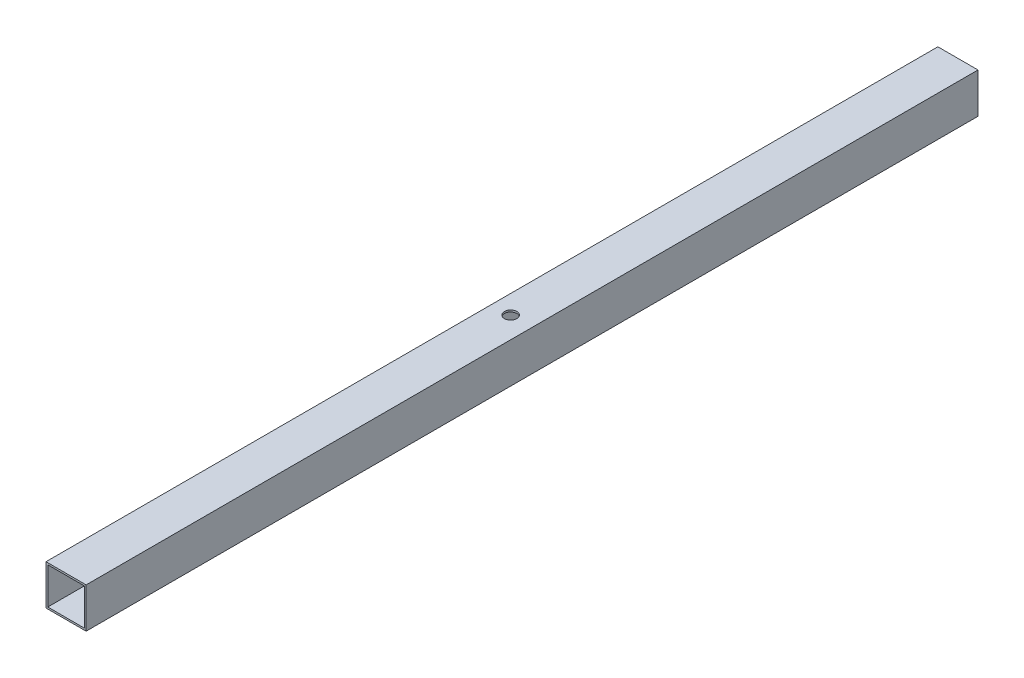
ISO-10303-21;
HEADER;
FILE_DESCRIPTION(('STEP AP214'),'2;1');
FILE_NAME('part.step','',(''),(''),'','','');
FILE_SCHEMA(('AUTOMOTIVE_DESIGN { 1 0 10303 214 1 1 1 1 }'));
ENDSEC;
DATA;
#1=APPLICATION_CONTEXT('core data for automotive mechanical design processes');
#2=APPLICATION_PROTOCOL_DEFINITION('international standard','automotive_design',2000,#1);
#3=PRODUCT_CONTEXT('',#1,'mechanical');
#4=PRODUCT('Part','Part','',(#3));
#5=PRODUCT_RELATED_PRODUCT_CATEGORY('part','',(#4));
#6=PRODUCT_DEFINITION_FORMATION('','',#4);
#7=PRODUCT_DEFINITION_CONTEXT('part definition',#1,'design');
#8=PRODUCT_DEFINITION('design','',#6,#7);
#9=PRODUCT_DEFINITION_SHAPE('','',#8);
#10=(LENGTH_UNIT() NAMED_UNIT(*) SI_UNIT(.MILLI.,.METRE.));
#11=(NAMED_UNIT(*) PLANE_ANGLE_UNIT() SI_UNIT($,.RADIAN.));
#12=(NAMED_UNIT(*) SI_UNIT($,.STERADIAN.) SOLID_ANGLE_UNIT());
#13=UNCERTAINTY_MEASURE_WITH_UNIT(LENGTH_MEASURE(1.E-05),#10,'distance_accuracy_value','');
#14=(GEOMETRIC_REPRESENTATION_CONTEXT(3) GLOBAL_UNCERTAINTY_ASSIGNED_CONTEXT((#13)) GLOBAL_UNIT_ASSIGNED_CONTEXT((#10,
#11,#12)) REPRESENTATION_CONTEXT('',''));
#15=CARTESIAN_POINT('',(0.,0.,0.));
#16=DIRECTION('',(0.,0.,1.));
#17=DIRECTION('',(1.,0.,0.));
#18=AXIS2_PLACEMENT_3D('',#15,#16,#17);
#19=CARTESIAN_POINT('',(45.,0.,1000.));
#20=DIRECTION('',(0.,1.,0.));
#21=DIRECTION('',(-1.,0.,0.));
#22=AXIS2_PLACEMENT_3D('',#19,#20,#21);
#23=PLANE('',#22);
#24=CARTESIAN_POINT('',(21.,0.,500.));
#25=DIRECTION('',(0.,-1.,0.));
#26=DIRECTION('',(1.,0.,0.));
#27=AXIS2_PLACEMENT_3D('',#24,#25,#26);
#28=CIRCLE('',#27,7.);
#29=CARTESIAN_POINT('',(28.,0.,500.));
#30=VERTEX_POINT('',#29);
#31=EDGE_CURVE('E304',#30,#30,#28,.T.);
#32=ORIENTED_EDGE('',*,*,#31,.F.);
#33=EDGE_LOOP('',(#32));
#34=FACE_BOUND('',#33,.T.);
#35=CARTESIAN_POINT('',(22.5,0.,980.));
#36=DIRECTION('',(0.,-1.,0.));
#37=DIRECTION('',(1.,0.,0.));
#38=AXIS2_PLACEMENT_3D('',#35,#36,#37);
#39=CIRCLE('',#38,7.);
#40=CARTESIAN_POINT('',(29.5,0.,980.));
#41=VERTEX_POINT('',#40);
#42=EDGE_CURVE('E309',#41,#41,#39,.T.);
#43=ORIENTED_EDGE('',*,*,#42,.F.);
#44=EDGE_LOOP('',(#43));
#45=FACE_BOUND('',#44,.T.);
#46=CARTESIAN_POINT('',(22.5,0.,60.));
#47=DIRECTION('',(0.,-1.,0.));
#48=DIRECTION('',(1.,0.,0.));
#49=AXIS2_PLACEMENT_3D('',#46,#47,#48);
#50=CIRCLE('',#49,7.);
#51=CARTESIAN_POINT('',(29.5,0.,60.));
#52=VERTEX_POINT('',#51);
#53=EDGE_CURVE('E299',#52,#52,#50,.T.);
#54=ORIENTED_EDGE('',*,*,#53,.F.);
#55=EDGE_LOOP('',(#54));
#56=FACE_BOUND('',#55,.T.);
#57=CARTESIAN_POINT('',(22.5,0.,20.));
#58=DIRECTION('',(0.,-1.,0.));
#59=DIRECTION('',(1.,0.,0.));
#60=AXIS2_PLACEMENT_3D('',#57,#58,#59);
#61=CIRCLE('',#60,7.);
#62=CARTESIAN_POINT('',(29.5,0.,20.));
#63=VERTEX_POINT('',#62);
#64=EDGE_CURVE('E323',#63,#63,#61,.T.);
#65=ORIENTED_EDGE('',*,*,#64,.F.);
#66=EDGE_LOOP('',(#65));
#67=FACE_BOUND('',#66,.T.);
#68=CARTESIAN_POINT('',(22.5,0.,940.));
#69=DIRECTION('',(0.,-1.,0.));
#70=DIRECTION('',(1.,0.,0.));
#71=AXIS2_PLACEMENT_3D('',#68,#69,#70);
#72=CIRCLE('',#71,7.00000000000001);
#73=CARTESIAN_POINT('',(29.5,0.,940.));
#74=VERTEX_POINT('',#73);
#75=EDGE_CURVE('E313',#74,#74,#72,.T.);
#76=ORIENTED_EDGE('',*,*,#75,.F.);
#77=EDGE_LOOP('',(#76));
#78=FACE_BOUND('',#77,.T.);
#79=DIRECTION('',(1.,0.,0.));
#80=VECTOR('',#79,1.);
#81=CARTESIAN_POINT('',(45.,0.,0.));
#82=LINE('',#81,#80);
#83=CARTESIAN_POINT('',(0.,0.,0.));
#84=VERTEX_POINT('',#83);
#85=CARTESIAN_POINT('',(45.,0.,0.));
#86=VERTEX_POINT('',#85);
#87=EDGE_CURVE('E158',#84,#86,#82,.T.);
#88=ORIENTED_EDGE('',*,*,#87,.T.);
#89=DIRECTION('',(0.,0.,-1.));
#90=VECTOR('',#89,1.);
#91=CARTESIAN_POINT('',(45.,0.,1000.));
#92=LINE('',#91,#90);
#93=CARTESIAN_POINT('',(45.,0.,1000.));
#94=VERTEX_POINT('',#93);
#95=EDGE_CURVE('E11',#94,#86,#92,.T.);
#96=ORIENTED_EDGE('',*,*,#95,.F.);
#97=DIRECTION('',(1.,0.,0.));
#98=VECTOR('',#97,1.);
#99=CARTESIAN_POINT('',(45.,0.,1000.));
#100=LINE('',#99,#98);
#101=CARTESIAN_POINT('',(0.,0.,1000.));
#102=VERTEX_POINT('',#101);
#103=EDGE_CURVE('E164',#102,#94,#100,.T.);
#104=ORIENTED_EDGE('',*,*,#103,.F.);
#105=DIRECTION('',(0.,0.,-1.));
#106=VECTOR('',#105,1.);
#107=CARTESIAN_POINT('',(0.,0.,1000.));
#108=LINE('',#107,#106);
#109=EDGE_CURVE('E178',#102,#84,#108,.T.);
#110=ORIENTED_EDGE('',*,*,#109,.T.);
#111=EDGE_LOOP('',(#88,#96,#104,#110));
#112=FACE_BOUND('',#111,.T.);
#113=ADVANCED_FACE('F45',(#34,#45,#56,#67,#78,#112),#23,.F.);
#114=CARTESIAN_POINT('',(45.,45.,1000.));
#115=DIRECTION('',(-1.,0.,0.));
#116=DIRECTION('',(0.,0.,1.));
#117=AXIS2_PLACEMENT_3D('',#114,#115,#116);
#118=PLANE('',#117);
#119=DIRECTION('',(0.,1.,0.));
#120=VECTOR('',#119,1.);
#121=CARTESIAN_POINT('',(45.,45.,0.));
#122=LINE('',#121,#120);
#123=CARTESIAN_POINT('',(45.,45.,0.));
#124=VERTEX_POINT('',#123);
#125=EDGE_CURVE('E182',#86,#124,#122,.T.);
#126=ORIENTED_EDGE('',*,*,#125,.T.);
#127=DIRECTION('',(0.,0.,-1.));
#128=VECTOR('',#127,1.);
#129=CARTESIAN_POINT('',(45.,45.,1000.));
#130=LINE('',#129,#128);
#131=CARTESIAN_POINT('',(45.,45.,1000.));
#132=VERTEX_POINT('',#131);
#133=EDGE_CURVE('E54',#132,#124,#130,.T.);
#134=ORIENTED_EDGE('',*,*,#133,.F.);
#135=DIRECTION('',(0.,1.,0.));
#136=VECTOR('',#135,1.);
#137=CARTESIAN_POINT('',(45.,45.,1000.));
#138=LINE('',#137,#136);
#139=EDGE_CURVE('E168',#94,#132,#138,.T.);
#140=ORIENTED_EDGE('',*,*,#139,.F.);
#141=ORIENTED_EDGE('',*,*,#95,.T.);
#142=EDGE_LOOP('',(#126,#134,#140,#141));
#143=FACE_BOUND('',#142,.T.);
#144=ADVANCED_FACE('F217',(#143),#118,.F.);
#145=CARTESIAN_POINT('',(0.,45.,1000.));
#146=DIRECTION('',(0.,-1.,0.));
#147=DIRECTION('',(0.,0.,-1.));
#148=AXIS2_PLACEMENT_3D('',#145,#146,#147);
#149=PLANE('',#148);
#150=CARTESIAN_POINT('',(21.,45.,500.));
#151=DIRECTION('',(0.,-1.,0.));
#152=DIRECTION('',(1.,0.,0.));
#153=AXIS2_PLACEMENT_3D('',#150,#151,#152);
#154=CIRCLE('',#153,7.);
#155=CARTESIAN_POINT('',(28.,45.,500.));
#156=VERTEX_POINT('',#155);
#157=EDGE_CURVE('E289',#156,#156,#154,.T.);
#158=ORIENTED_EDGE('',*,*,#157,.T.);
#159=EDGE_LOOP('',(#158));
#160=FACE_BOUND('',#159,.T.);
#161=DIRECTION('',(-1.,0.,0.));
#162=VECTOR('',#161,1.);
#163=CARTESIAN_POINT('',(0.,45.,0.));
#164=LINE('',#163,#162);
#165=CARTESIAN_POINT('',(0.,45.,0.));
#166=VERTEX_POINT('',#165);
#167=EDGE_CURVE('E185',#124,#166,#164,.T.);
#168=ORIENTED_EDGE('',*,*,#167,.T.);
#169=DIRECTION('',(0.,0.,-1.));
#170=VECTOR('',#169,1.);
#171=CARTESIAN_POINT('',(0.,45.,1000.));
#172=LINE('',#171,#170);
#173=CARTESIAN_POINT('',(0.,45.,1000.));
#174=VERTEX_POINT('',#173);
#175=EDGE_CURVE('E193',#174,#166,#172,.T.);
#176=ORIENTED_EDGE('',*,*,#175,.F.);
#177=DIRECTION('',(-1.,0.,0.));
#178=VECTOR('',#177,1.);
#179=CARTESIAN_POINT('',(0.,45.,1000.));
#180=LINE('',#179,#178);
#181=EDGE_CURVE('E172',#132,#174,#180,.T.);
#182=ORIENTED_EDGE('',*,*,#181,.F.);
#183=ORIENTED_EDGE('',*,*,#133,.T.);
#184=EDGE_LOOP('',(#168,#176,#182,#183));
#185=FACE_BOUND('',#184,.T.);
#186=ADVANCED_FACE('F203',(#160,#185),#149,.F.);
#187=CARTESIAN_POINT('',(0.,0.,1000.));
#188=DIRECTION('',(1.,0.,0.));
#189=DIRECTION('',(0.,0.,-1.));
#190=AXIS2_PLACEMENT_3D('',#187,#188,#189);
#191=PLANE('',#190);
#192=DIRECTION('',(0.,-1.,0.));
#193=VECTOR('',#192,1.);
#194=CARTESIAN_POINT('',(0.,0.,0.));
#195=LINE('',#194,#193);
#196=EDGE_CURVE('E169',#166,#84,#195,.T.);
#197=ORIENTED_EDGE('',*,*,#196,.T.);
#198=ORIENTED_EDGE('',*,*,#109,.F.);
#199=DIRECTION('',(0.,-1.,0.));
#200=VECTOR('',#199,1.);
#201=CARTESIAN_POINT('',(0.,0.,1000.));
#202=LINE('',#201,#200);
#203=EDGE_CURVE('E175',#174,#102,#202,.T.);
#204=ORIENTED_EDGE('',*,*,#203,.F.);
#205=ORIENTED_EDGE('',*,*,#175,.T.);
#206=EDGE_LOOP('',(#197,#198,#204,#205));
#207=FACE_BOUND('',#206,.T.);
#208=ADVANCED_FACE('F212',(#207),#191,.F.);
#209=CARTESIAN_POINT('',(0.,0.,1000.));
#210=DIRECTION('',(0.,0.,-1.));
#211=DIRECTION('',(-1.,0.,0.));
#212=AXIS2_PLACEMENT_3D('',#209,#210,#211);
#213=PLANE('',#212);
#214=DIRECTION('',(1.,0.,0.));
#215=VECTOR('',#214,1.);
#216=CARTESIAN_POINT('',(43.,43.,1000.));
#217=LINE('',#216,#215);
#218=CARTESIAN_POINT('',(2.,43.,1000.));
#219=VERTEX_POINT('',#218);
#220=CARTESIAN_POINT('',(43.,43.,1000.));
#221=VERTEX_POINT('',#220);
#222=EDGE_CURVE('E120',#219,#221,#217,.T.);
#223=ORIENTED_EDGE('',*,*,#222,.T.);
#224=DIRECTION('',(0.,-1.,0.));
#225=VECTOR('',#224,1.);
#226=CARTESIAN_POINT('',(43.,43.,1000.));
#227=LINE('',#226,#225);
#228=CARTESIAN_POINT('',(43.,2.,1000.));
#229=VERTEX_POINT('',#228);
#230=EDGE_CURVE('E113',#221,#229,#227,.T.);
#231=ORIENTED_EDGE('',*,*,#230,.T.);
#232=DIRECTION('',(-1.,0.,0.));
#233=VECTOR('',#232,1.);
#234=CARTESIAN_POINT('',(43.,2.,1000.));
#235=LINE('',#234,#233);
#236=CARTESIAN_POINT('',(1.99999999999999,2.,1000.));
#237=VERTEX_POINT('',#236);
#238=EDGE_CURVE('E123',#229,#237,#235,.T.);
#239=ORIENTED_EDGE('',*,*,#238,.T.);
#240=DIRECTION('',(0.,1.,0.));
#241=VECTOR('',#240,1.);
#242=CARTESIAN_POINT('',(2.,43.,1000.));
#243=LINE('',#242,#241);
#244=EDGE_CURVE('E61',#237,#219,#243,.T.);
#245=ORIENTED_EDGE('',*,*,#244,.T.);
#246=EDGE_LOOP('',(#223,#231,#239,#245));
#247=FACE_BOUND('',#246,.T.);
#248=ORIENTED_EDGE('',*,*,#103,.T.);
#249=ORIENTED_EDGE('',*,*,#139,.T.);
#250=ORIENTED_EDGE('',*,*,#181,.T.);
#251=ORIENTED_EDGE('',*,*,#203,.T.);
#252=EDGE_LOOP('',(#248,#249,#250,#251));
#253=FACE_BOUND('',#252,.T.);
#254=ADVANCED_FACE('F128',(#247,#253),#213,.F.);
#255=CARTESIAN_POINT('',(0.,0.,0.));
#256=DIRECTION('',(0.,0.,-1.));
#257=DIRECTION('',(-1.,0.,0.));
#258=AXIS2_PLACEMENT_3D('',#255,#256,#257);
#259=PLANE('',#258);
#260=DIRECTION('',(0.,-1.,0.));
#261=VECTOR('',#260,1.);
#262=CARTESIAN_POINT('',(43.,43.,0.));
#263=LINE('',#262,#261);
#264=CARTESIAN_POINT('',(43.,43.,0.));
#265=VERTEX_POINT('',#264);
#266=CARTESIAN_POINT('',(43.,2.,0.));
#267=VERTEX_POINT('',#266);
#268=EDGE_CURVE('E69',#265,#267,#263,.T.);
#269=ORIENTED_EDGE('',*,*,#268,.F.);
#270=DIRECTION('',(1.,0.,0.));
#271=VECTOR('',#270,1.);
#272=CARTESIAN_POINT('',(43.,43.,0.));
#273=LINE('',#272,#271);
#274=CARTESIAN_POINT('',(2.,43.,0.));
#275=VERTEX_POINT('',#274);
#276=EDGE_CURVE('E132',#275,#265,#273,.T.);
#277=ORIENTED_EDGE('',*,*,#276,.F.);
#278=DIRECTION('',(0.,1.,0.));
#279=VECTOR('',#278,1.);
#280=CARTESIAN_POINT('',(2.,43.,0.));
#281=LINE('',#280,#279);
#282=CARTESIAN_POINT('',(1.99999999999999,2.,0.));
#283=VERTEX_POINT('',#282);
#284=EDGE_CURVE('E136',#283,#275,#281,.T.);
#285=ORIENTED_EDGE('',*,*,#284,.F.);
#286=DIRECTION('',(-1.,0.,0.));
#287=VECTOR('',#286,1.);
#288=CARTESIAN_POINT('',(43.,2.,0.));
#289=LINE('',#288,#287);
#290=EDGE_CURVE('E148',#267,#283,#289,.T.);
#291=ORIENTED_EDGE('',*,*,#290,.F.);
#292=EDGE_LOOP('',(#269,#277,#285,#291));
#293=FACE_BOUND('',#292,.T.);
#294=ORIENTED_EDGE('',*,*,#87,.F.);
#295=ORIENTED_EDGE('',*,*,#196,.F.);
#296=ORIENTED_EDGE('',*,*,#167,.F.);
#297=ORIENTED_EDGE('',*,*,#125,.F.);
#298=EDGE_LOOP('',(#294,#295,#296,#297));
#299=FACE_BOUND('',#298,.T.);
#300=ADVANCED_FACE('F209',(#293,#299),#259,.T.);
#301=CARTESIAN_POINT('',(43.,43.,1000.));
#302=DIRECTION('',(1.,0.,0.));
#303=DIRECTION('',(0.,1.,0.));
#304=AXIS2_PLACEMENT_3D('',#301,#302,#303);
#305=PLANE('',#304);
#306=ORIENTED_EDGE('',*,*,#268,.T.);
#307=DIRECTION('',(0.,0.,-1.));
#308=VECTOR('',#307,1.);
#309=CARTESIAN_POINT('',(43.,2.,1000.));
#310=LINE('',#309,#308);
#311=EDGE_CURVE('E109',#229,#267,#310,.T.);
#312=ORIENTED_EDGE('',*,*,#311,.F.);
#313=ORIENTED_EDGE('',*,*,#230,.F.);
#314=DIRECTION('',(0.,0.,-1.));
#315=VECTOR('',#314,1.);
#316=CARTESIAN_POINT('',(43.,43.,1000.));
#317=LINE('',#316,#315);
#318=EDGE_CURVE('E155',#221,#265,#317,.T.);
#319=ORIENTED_EDGE('',*,*,#318,.T.);
#320=EDGE_LOOP('',(#306,#312,#313,#319));
#321=FACE_BOUND('',#320,.T.);
#322=ADVANCED_FACE('F111',(#321),#305,.F.);
#323=CARTESIAN_POINT('',(43.,43.,1000.));
#324=DIRECTION('',(0.,1.,0.));
#325=DIRECTION('',(0.,0.,1.));
#326=AXIS2_PLACEMENT_3D('',#323,#324,#325);
#327=PLANE('',#326);
#328=CARTESIAN_POINT('',(21.,43.,500.));
#329=DIRECTION('',(0.,1.,0.));
#330=DIRECTION('',(0.,0.,1.));
#331=AXIS2_PLACEMENT_3D('',#328,#329,#330);
#332=CIRCLE('',#331,7.);
#333=CARTESIAN_POINT('',(28.,43.,500.));
#334=VERTEX_POINT('',#333);
#335=EDGE_CURVE('E292',#334,#334,#332,.T.);
#336=ORIENTED_EDGE('',*,*,#335,.T.);
#337=EDGE_LOOP('',(#336));
#338=FACE_BOUND('',#337,.T.);
#339=ORIENTED_EDGE('',*,*,#276,.T.);
#340=ORIENTED_EDGE('',*,*,#318,.F.);
#341=ORIENTED_EDGE('',*,*,#222,.F.);
#342=DIRECTION('',(0.,0.,-1.));
#343=VECTOR('',#342,1.);
#344=CARTESIAN_POINT('',(2.,43.,1000.));
#345=LINE('',#344,#343);
#346=EDGE_CURVE('E159',#219,#275,#345,.T.);
#347=ORIENTED_EDGE('',*,*,#346,.T.);
#348=EDGE_LOOP('',(#339,#340,#341,#347));
#349=FACE_BOUND('',#348,.T.);
#350=ADVANCED_FACE('F236',(#338,#349),#327,.F.);
#351=CARTESIAN_POINT('',(2.,43.,1000.));
#352=DIRECTION('',(-1.,0.,0.));
#353=DIRECTION('',(0.,-1.,0.));
#354=AXIS2_PLACEMENT_3D('',#351,#352,#353);
#355=PLANE('',#354);
#356=ORIENTED_EDGE('',*,*,#284,.T.);
#357=ORIENTED_EDGE('',*,*,#346,.F.);
#358=ORIENTED_EDGE('',*,*,#244,.F.);
#359=DIRECTION('',(0.,0.,-1.));
#360=VECTOR('',#359,1.);
#361=CARTESIAN_POINT('',(1.99999999999999,2.,1000.));
#362=LINE('',#361,#360);
#363=EDGE_CURVE('E119',#237,#283,#362,.T.);
#364=ORIENTED_EDGE('',*,*,#363,.T.);
#365=EDGE_LOOP('',(#356,#357,#358,#364));
#366=FACE_BOUND('',#365,.T.);
#367=ADVANCED_FACE('F240',(#366),#355,.F.);
#368=CARTESIAN_POINT('',(43.,2.,1000.));
#369=DIRECTION('',(0.,-1.,0.));
#370=DIRECTION('',(0.,0.,-1.));
#371=AXIS2_PLACEMENT_3D('',#368,#369,#370);
#372=PLANE('',#371);
#373=CARTESIAN_POINT('',(21.,2.,500.));
#374=DIRECTION('',(0.,-1.,0.));
#375=DIRECTION('',(0.,0.,-1.));
#376=AXIS2_PLACEMENT_3D('',#373,#374,#375);
#377=CIRCLE('',#376,7.);
#378=CARTESIAN_POINT('',(28.,2.00000000000001,500.));
#379=VERTEX_POINT('',#378);
#380=EDGE_CURVE('E48',#379,#379,#377,.T.);
#381=ORIENTED_EDGE('',*,*,#380,.T.);
#382=EDGE_LOOP('',(#381));
#383=FACE_BOUND('',#382,.T.);
#384=ORIENTED_EDGE('',*,*,#290,.T.);
#385=ORIENTED_EDGE('',*,*,#363,.F.);
#386=ORIENTED_EDGE('',*,*,#238,.F.);
#387=ORIENTED_EDGE('',*,*,#311,.T.);
#388=EDGE_LOOP('',(#384,#385,#386,#387));
#389=FACE_BOUND('',#388,.T.);
#390=ADVANCED_FACE('F124',(#383,#389),#372,.F.);
#391=CARTESIAN_POINT('',(22.5,1.6,940.));
#392=DIRECTION('',(0.,-1.,0.));
#393=DIRECTION('',(1.,0.,0.));
#394=AXIS2_PLACEMENT_3D('',#391,#392,#393);
#395=CYLINDRICAL_SURFACE('',#394,7.00000000000001);
#396=CARTESIAN_POINT('',(22.5,1.6,940.));
#397=DIRECTION('',(0.,-1.,0.));
#398=DIRECTION('',(1.,0.,0.));
#399=AXIS2_PLACEMENT_3D('',#396,#397,#398);
#400=CIRCLE('',#399,7.00000000000001);
#401=CARTESIAN_POINT('',(29.5,1.6,940.));
#402=VERTEX_POINT('',#401);
#403=EDGE_CURVE('E320',#402,#402,#400,.T.);
#404=ORIENTED_EDGE('',*,*,#403,.F.);
#405=EDGE_LOOP('',(#404));
#406=FACE_BOUND('',#405,.T.);
#407=ORIENTED_EDGE('',*,*,#75,.T.);
#408=EDGE_LOOP('',(#407));
#409=FACE_BOUND('',#408,.T.);
#410=ADVANCED_FACE('F239',(#406,#409),#395,.F.);
#411=CARTESIAN_POINT('',(22.5,1.6,940.));
#412=DIRECTION('',(0.,-1.,0.));
#413=DIRECTION('',(1.,0.,0.));
#414=AXIS2_PLACEMENT_3D('',#411,#412,#413);
#415=PLANE('',#414);
#416=ORIENTED_EDGE('',*,*,#403,.T.);
#417=EDGE_LOOP('',(#416));
#418=FACE_BOUND('',#417,.T.);
#419=ADVANCED_FACE('F255',(#418),#415,.T.);
#420=CARTESIAN_POINT('',(22.5,1.6,20.));
#421=DIRECTION('',(0.,-1.,0.));
#422=DIRECTION('',(1.,0.,0.));
#423=AXIS2_PLACEMENT_3D('',#420,#421,#422);
#424=CYLINDRICAL_SURFACE('',#423,7.);
#425=CARTESIAN_POINT('',(22.5,1.6,20.));
#426=DIRECTION('',(0.,-1.,0.));
#427=DIRECTION('',(1.,0.,0.));
#428=AXIS2_PLACEMENT_3D('',#425,#426,#427);
#429=CIRCLE('',#428,7.);
#430=CARTESIAN_POINT('',(29.5,1.6,20.));
#431=VERTEX_POINT('',#430);
#432=EDGE_CURVE('E139',#431,#431,#429,.T.);
#433=ORIENTED_EDGE('',*,*,#432,.F.);
#434=EDGE_LOOP('',(#433));
#435=FACE_BOUND('',#434,.T.);
#436=ORIENTED_EDGE('',*,*,#64,.T.);
#437=EDGE_LOOP('',(#436));
#438=FACE_BOUND('',#437,.T.);
#439=ADVANCED_FACE('F251',(#435,#438),#424,.F.);
#440=CARTESIAN_POINT('',(22.5,1.6,20.));
#441=DIRECTION('',(0.,-1.,0.));
#442=DIRECTION('',(1.,0.,0.));
#443=AXIS2_PLACEMENT_3D('',#440,#441,#442);
#444=PLANE('',#443);
#445=ORIENTED_EDGE('',*,*,#432,.T.);
#446=EDGE_LOOP('',(#445));
#447=FACE_BOUND('',#446,.T.);
#448=ADVANCED_FACE('F247',(#447),#444,.T.);
#449=CARTESIAN_POINT('',(22.5,1.6,60.));
#450=DIRECTION('',(0.,-1.,0.));
#451=DIRECTION('',(1.,0.,0.));
#452=AXIS2_PLACEMENT_3D('',#449,#450,#451);
#453=CYLINDRICAL_SURFACE('',#452,7.);
#454=CARTESIAN_POINT('',(22.5,1.6,60.));
#455=DIRECTION('',(0.,-1.,0.));
#456=DIRECTION('',(1.,0.,0.));
#457=AXIS2_PLACEMENT_3D('',#454,#455,#456);
#458=CIRCLE('',#457,7.);
#459=CARTESIAN_POINT('',(29.5,1.6,60.));
#460=VERTEX_POINT('',#459);
#461=EDGE_CURVE('E294',#460,#460,#458,.T.);
#462=ORIENTED_EDGE('',*,*,#461,.F.);
#463=EDGE_LOOP('',(#462));
#464=FACE_BOUND('',#463,.T.);
#465=ORIENTED_EDGE('',*,*,#53,.T.);
#466=EDGE_LOOP('',(#465));
#467=FACE_BOUND('',#466,.T.);
#468=ADVANCED_FACE('F250',(#464,#467),#453,.F.);
#469=CARTESIAN_POINT('',(22.5,1.6,60.));
#470=DIRECTION('',(0.,-1.,0.));
#471=DIRECTION('',(1.,0.,0.));
#472=AXIS2_PLACEMENT_3D('',#469,#470,#471);
#473=PLANE('',#472);
#474=ORIENTED_EDGE('',*,*,#461,.T.);
#475=EDGE_LOOP('',(#474));
#476=FACE_BOUND('',#475,.T.);
#477=ADVANCED_FACE('F263',(#476),#473,.T.);
#478=CARTESIAN_POINT('',(22.5,1.6,980.));
#479=DIRECTION('',(0.,-1.,0.));
#480=DIRECTION('',(1.,0.,0.));
#481=AXIS2_PLACEMENT_3D('',#478,#479,#480);
#482=CYLINDRICAL_SURFACE('',#481,7.);
#483=CARTESIAN_POINT('',(22.5,1.6,980.));
#484=DIRECTION('',(0.,-1.,0.));
#485=DIRECTION('',(1.,0.,0.));
#486=AXIS2_PLACEMENT_3D('',#483,#484,#485);
#487=CIRCLE('',#486,7.);
#488=CARTESIAN_POINT('',(29.5,1.6,980.));
#489=VERTEX_POINT('',#488);
#490=EDGE_CURVE('E149',#489,#489,#487,.T.);
#491=ORIENTED_EDGE('',*,*,#490,.F.);
#492=EDGE_LOOP('',(#491));
#493=FACE_BOUND('',#492,.T.);
#494=ORIENTED_EDGE('',*,*,#42,.T.);
#495=EDGE_LOOP('',(#494));
#496=FACE_BOUND('',#495,.T.);
#497=ADVANCED_FACE('F266',(#493,#496),#482,.F.);
#498=CARTESIAN_POINT('',(22.5,1.6,980.));
#499=DIRECTION('',(0.,-1.,0.));
#500=DIRECTION('',(1.,0.,0.));
#501=AXIS2_PLACEMENT_3D('',#498,#499,#500);
#502=PLANE('',#501);
#503=ORIENTED_EDGE('',*,*,#490,.T.);
#504=EDGE_LOOP('',(#503));
#505=FACE_BOUND('',#504,.T.);
#506=ADVANCED_FACE('F273',(#505),#502,.T.);
#507=CARTESIAN_POINT('',(21.,45.,500.));
#508=DIRECTION('',(0.,-1.,0.));
#509=DIRECTION('',(1.,0.,0.));
#510=AXIS2_PLACEMENT_3D('',#507,#508,#509);
#511=CYLINDRICAL_SURFACE('',#510,7.);
#512=CARTESIAN_POINT('',(28.,0.,500.));
#513=CARTESIAN_POINT('',(28.,0.0208333333333403,500.));
#514=CARTESIAN_POINT('',(28.,0.0416666666666736,500.));
#515=CARTESIAN_POINT('',(28.,0.0833333333333404,500.));
#516=CARTESIAN_POINT('',(28.,0.104166666666674,500.));
#517=CARTESIAN_POINT('',(28.,0.14583333333334,500.));
#518=CARTESIAN_POINT('',(28.,0.166666666666674,500.));
#519=CARTESIAN_POINT('',(28.,0.20833333333334,500.));
#520=CARTESIAN_POINT('',(28.,0.229166666666674,500.));
#521=CARTESIAN_POINT('',(28.,0.270833333333341,500.));
#522=CARTESIAN_POINT('',(28.,0.291666666666674,500.));
#523=CARTESIAN_POINT('',(28.,0.333333333333341,500.));
#524=CARTESIAN_POINT('',(28.,0.354166666666674,500.));
#525=CARTESIAN_POINT('',(28.,0.395833333333341,500.));
#526=CARTESIAN_POINT('',(28.,0.416666666666674,500.));
#527=CARTESIAN_POINT('',(28.,0.458333333333341,500.));
#528=CARTESIAN_POINT('',(28.,0.479166666666674,500.));
#529=CARTESIAN_POINT('',(28.,0.520833333333341,500.));
#530=CARTESIAN_POINT('',(28.,0.541666666666674,500.));
#531=CARTESIAN_POINT('',(28.,0.583333333333341,500.));
#532=CARTESIAN_POINT('',(28.,0.604166666666674,500.));
#533=CARTESIAN_POINT('',(28.,0.645833333333341,500.));
#534=CARTESIAN_POINT('',(28.,0.666666666666674,500.));
#535=CARTESIAN_POINT('',(28.,0.708333333333341,500.));
#536=CARTESIAN_POINT('',(28.,0.729166666666674,500.));
#537=CARTESIAN_POINT('',(28.,0.770833333333341,500.));
#538=CARTESIAN_POINT('',(28.,0.791666666666674,500.));
#539=CARTESIAN_POINT('',(28.,0.833333333333341,500.));
#540=CARTESIAN_POINT('',(28.,0.854166666666674,500.));
#541=CARTESIAN_POINT('',(28.,0.895833333333341,500.));
#542=CARTESIAN_POINT('',(28.,0.916666666666674,500.));
#543=CARTESIAN_POINT('',(28.,0.958333333333341,500.));
#544=CARTESIAN_POINT('',(28.,0.979166666666674,500.));
#545=CARTESIAN_POINT('',(28.,1.02083333333334,500.));
#546=CARTESIAN_POINT('',(28.,1.04166666666667,500.));
#547=CARTESIAN_POINT('',(28.,1.08333333333334,500.));
#548=CARTESIAN_POINT('',(28.,1.10416666666667,500.));
#549=CARTESIAN_POINT('',(28.,1.14583333333334,500.));
#550=CARTESIAN_POINT('',(28.,1.16666666666667,500.));
#551=CARTESIAN_POINT('',(28.,1.20833333333334,500.));
#552=CARTESIAN_POINT('',(28.,1.22916666666667,500.));
#553=CARTESIAN_POINT('',(28.,1.27083333333334,500.));
#554=CARTESIAN_POINT('',(28.,1.29166666666667,500.));
#555=CARTESIAN_POINT('',(28.,1.33333333333334,500.));
#556=CARTESIAN_POINT('',(28.,1.35416666666667,500.));
#557=CARTESIAN_POINT('',(28.,1.39583333333334,500.));
#558=CARTESIAN_POINT('',(28.,1.41666666666667,500.));
#559=CARTESIAN_POINT('',(28.,1.45833333333334,500.));
#560=CARTESIAN_POINT('',(28.,1.47916666666667,500.));
#561=CARTESIAN_POINT('',(28.,1.52083333333334,500.));
#562=CARTESIAN_POINT('',(28.,1.54166666666667,500.));
#563=CARTESIAN_POINT('',(28.,1.58333333333334,500.));
#564=CARTESIAN_POINT('',(28.,1.60416666666667,500.));
#565=CARTESIAN_POINT('',(28.,1.64583333333334,500.));
#566=CARTESIAN_POINT('',(28.,1.66666666666667,500.));
#567=CARTESIAN_POINT('',(28.,1.70833333333334,500.));
#568=CARTESIAN_POINT('',(28.,1.72916666666668,500.));
#569=CARTESIAN_POINT('',(28.,1.77083333333334,500.));
#570=CARTESIAN_POINT('',(28.,1.79166666666668,500.));
#571=CARTESIAN_POINT('',(28.,1.83333333333334,500.));
#572=CARTESIAN_POINT('',(28.,1.85416666666668,500.));
#573=CARTESIAN_POINT('',(28.,1.89583333333334,500.));
#574=CARTESIAN_POINT('',(28.,1.91666666666668,500.));
#575=CARTESIAN_POINT('',(28.,1.95833333333334,500.));
#576=CARTESIAN_POINT('',(28.,1.97916666666668,500.));
#577=CARTESIAN_POINT('',(28.,2.00000000000001,500.));
#578=B_SPLINE_CURVE_WITH_KNOTS('',3,(#512,#513,#514,#515,#516,#517,#518,#519,#520,#521,#522,
#523,#524,#525,#526,#527,#528,#529,#530,#531,#532,#533,#534,#535,#536,#537,#538,#539,#540,#541,
#542,#543,#544,#545,#546,#547,#548,#549,#550,#551,#552,#553,#554,#555,#556,#557,#558,#559,#560,
#561,#562,#563,#564,#565,#566,#567,#568,#569,#570,#571,#572,#573,#574,#575,#576,#577),
.UNSPECIFIED.,.F.,.F.,(4,2,2,2,2,2,2,2,2,2,2,2,2,2,2,2,2,2,2,2,2,2,2,2,2,2,2,2,2,2,2,2,4),(0.,
0.0625000000000001,0.125,0.1875,0.25,0.3125,0.375,0.4375,0.5,0.5625,0.625000000000001,
0.687500000000001,0.750000000000001,0.812500000000001,0.875000000000001,0.937500000000001,1.,
1.0625,1.125,1.1875,1.25,1.3125,1.375,1.4375,1.5,1.5625,1.625,1.6875,1.75,1.8125,1.875,1.9375,
2.),.UNSPECIFIED.);
#579=EDGE_CURVE('BSEAM277',#30,#379,#578,.T.);
#580=ORIENTED_EDGE('',*,*,#31,.T.);
#581=ORIENTED_EDGE('',*,*,#380,.F.);
#582=ORIENTED_EDGE('',*,*,#579,.T.);
#583=ORIENTED_EDGE('',*,*,#579,.F.);
#584=EDGE_LOOP('',(#580,#582,#581,#583));
#585=FACE_BOUND('',#584,.T.);
#586=ADVANCED_FACE('F277',(#585),#511,.F.);
#587=CARTESIAN_POINT('',(28.,45.,500.));
#588=CARTESIAN_POINT('',(28.,44.9791666666667,500.));
#589=CARTESIAN_POINT('',(28.,44.9583333333333,500.));
#590=CARTESIAN_POINT('',(28.,44.9166666666667,500.));
#591=CARTESIAN_POINT('',(28.,44.8958333333333,500.));
#592=CARTESIAN_POINT('',(28.,44.8541666666667,500.));
#593=CARTESIAN_POINT('',(28.,44.8333333333333,500.));
#594=CARTESIAN_POINT('',(28.,44.7916666666667,500.));
#595=CARTESIAN_POINT('',(28.,44.7708333333333,500.));
#596=CARTESIAN_POINT('',(28.,44.7291666666667,500.));
#597=CARTESIAN_POINT('',(28.,44.7083333333333,500.));
#598=CARTESIAN_POINT('',(28.,44.6666666666667,500.));
#599=CARTESIAN_POINT('',(28.,44.6458333333333,500.));
#600=CARTESIAN_POINT('',(28.,44.6041666666667,500.));
#601=CARTESIAN_POINT('',(28.,44.5833333333333,500.));
#602=CARTESIAN_POINT('',(28.,44.5416666666667,500.));
#603=CARTESIAN_POINT('',(28.,44.5208333333333,500.));
#604=CARTESIAN_POINT('',(28.,44.4791666666667,500.));
#605=CARTESIAN_POINT('',(28.,44.4583333333333,500.));
#606=CARTESIAN_POINT('',(28.,44.4166666666667,500.));
#607=CARTESIAN_POINT('',(28.,44.3958333333333,500.));
#608=CARTESIAN_POINT('',(28.,44.3541666666667,500.));
#609=CARTESIAN_POINT('',(28.,44.3333333333333,500.));
#610=CARTESIAN_POINT('',(28.,44.2916666666667,500.));
#611=CARTESIAN_POINT('',(28.,44.2708333333333,500.));
#612=CARTESIAN_POINT('',(28.,44.2291666666667,500.));
#613=CARTESIAN_POINT('',(28.,44.2083333333333,500.));
#614=CARTESIAN_POINT('',(28.,44.1666666666667,500.));
#615=CARTESIAN_POINT('',(28.,44.1458333333333,500.));
#616=CARTESIAN_POINT('',(28.,44.1041666666667,500.));
#617=CARTESIAN_POINT('',(28.,44.0833333333333,500.));
#618=CARTESIAN_POINT('',(28.,44.0416666666667,500.));
#619=CARTESIAN_POINT('',(28.,44.0208333333333,500.));
#620=CARTESIAN_POINT('',(28.,43.9791666666667,500.));
#621=CARTESIAN_POINT('',(28.,43.9583333333333,500.));
#622=CARTESIAN_POINT('',(28.,43.9166666666667,500.));
#623=CARTESIAN_POINT('',(28.,43.8958333333333,500.));
#624=CARTESIAN_POINT('',(28.,43.8541666666667,500.));
#625=CARTESIAN_POINT('',(28.,43.8333333333333,500.));
#626=CARTESIAN_POINT('',(28.,43.7916666666667,500.));
#627=CARTESIAN_POINT('',(28.,43.7708333333333,500.));
#628=CARTESIAN_POINT('',(28.,43.7291666666667,500.));
#629=CARTESIAN_POINT('',(28.,43.7083333333333,500.));
#630=CARTESIAN_POINT('',(28.,43.6666666666667,500.));
#631=CARTESIAN_POINT('',(28.,43.6458333333333,500.));
#632=CARTESIAN_POINT('',(28.,43.6041666666667,500.));
#633=CARTESIAN_POINT('',(28.,43.5833333333333,500.));
#634=CARTESIAN_POINT('',(28.,43.5416666666667,500.));
#635=CARTESIAN_POINT('',(28.,43.5208333333333,500.));
#636=CARTESIAN_POINT('',(28.,43.4791666666667,500.));
#637=CARTESIAN_POINT('',(28.,43.4583333333333,500.));
#638=CARTESIAN_POINT('',(28.,43.4166666666667,500.));
#639=CARTESIAN_POINT('',(28.,43.3958333333333,500.));
#640=CARTESIAN_POINT('',(28.,43.3541666666667,500.));
#641=CARTESIAN_POINT('',(28.,43.3333333333333,500.));
#642=CARTESIAN_POINT('',(28.,43.2916666666667,500.));
#643=CARTESIAN_POINT('',(28.,43.2708333333333,500.));
#644=CARTESIAN_POINT('',(28.,43.2291666666667,500.));
#645=CARTESIAN_POINT('',(28.,43.2083333333333,500.));
#646=CARTESIAN_POINT('',(28.,43.1666666666667,500.));
#647=CARTESIAN_POINT('',(28.,43.1458333333333,500.));
#648=CARTESIAN_POINT('',(28.,43.1041666666667,500.));
#649=CARTESIAN_POINT('',(28.,43.0833333333333,500.));
#650=CARTESIAN_POINT('',(28.,43.0416666666667,500.));
#651=CARTESIAN_POINT('',(28.,43.0208333333333,500.));
#652=CARTESIAN_POINT('',(28.,43.,500.));
#653=B_SPLINE_CURVE_WITH_KNOTS('',3,(#587,#588,#589,#590,#591,#592,#593,#594,#595,#596,#597,
#598,#599,#600,#601,#602,#603,#604,#605,#606,#607,#608,#609,#610,#611,#612,#613,#614,#615,#616,
#617,#618,#619,#620,#621,#622,#623,#624,#625,#626,#627,#628,#629,#630,#631,#632,#633,#634,#635,
#636,#637,#638,#639,#640,#641,#642,#643,#644,#645,#646,#647,#648,#649,#650,#651,#652),
.UNSPECIFIED.,.F.,.F.,(4,2,2,2,2,2,2,2,2,2,2,2,2,2,2,2,2,2,2,2,2,2,2,2,2,2,2,2,2,2,2,2,4),(0.,
0.0625000000000001,0.125,0.1875,0.25,0.3125,0.375,0.4375,0.5,0.5625,0.625000000000001,
0.687500000000001,0.750000000000001,0.812500000000001,0.875000000000001,0.937500000000001,1.,
1.0625,1.125,1.1875,1.25,1.3125,1.375,1.4375,1.5,1.5625,1.625,1.6875,1.75,1.81250000000001,
1.87500000000001,1.93750000000001,2.00000000000001),.UNSPECIFIED.);
#654=EDGE_CURVE('BSEAM279',#156,#334,#653,.T.);
#655=ORIENTED_EDGE('',*,*,#157,.F.);
#656=ORIENTED_EDGE('',*,*,#335,.F.);
#657=ORIENTED_EDGE('',*,*,#654,.T.);
#658=ORIENTED_EDGE('',*,*,#654,.F.);
#659=EDGE_LOOP('',(#655,#657,#656,#658));
#660=FACE_BOUND('',#659,.T.);
#661=ADVANCED_FACE('F279',(#660),#511,.F.);
#662=CLOSED_SHELL('',(#113,#144,#186,#208,#254,#300,#322,#350,#367,#390,#410,#419,#439,#448,
#468,#477,#497,#506,#586,#661));
#663=MANIFOLD_SOLID_BREP('B2',#662);
#664=ADVANCED_BREP_SHAPE_REPRESENTATION('',(#18,#663),#14);
#665=SHAPE_DEFINITION_REPRESENTATION(#9,#664);
ENDSEC;
END-ISO-10303-21;
